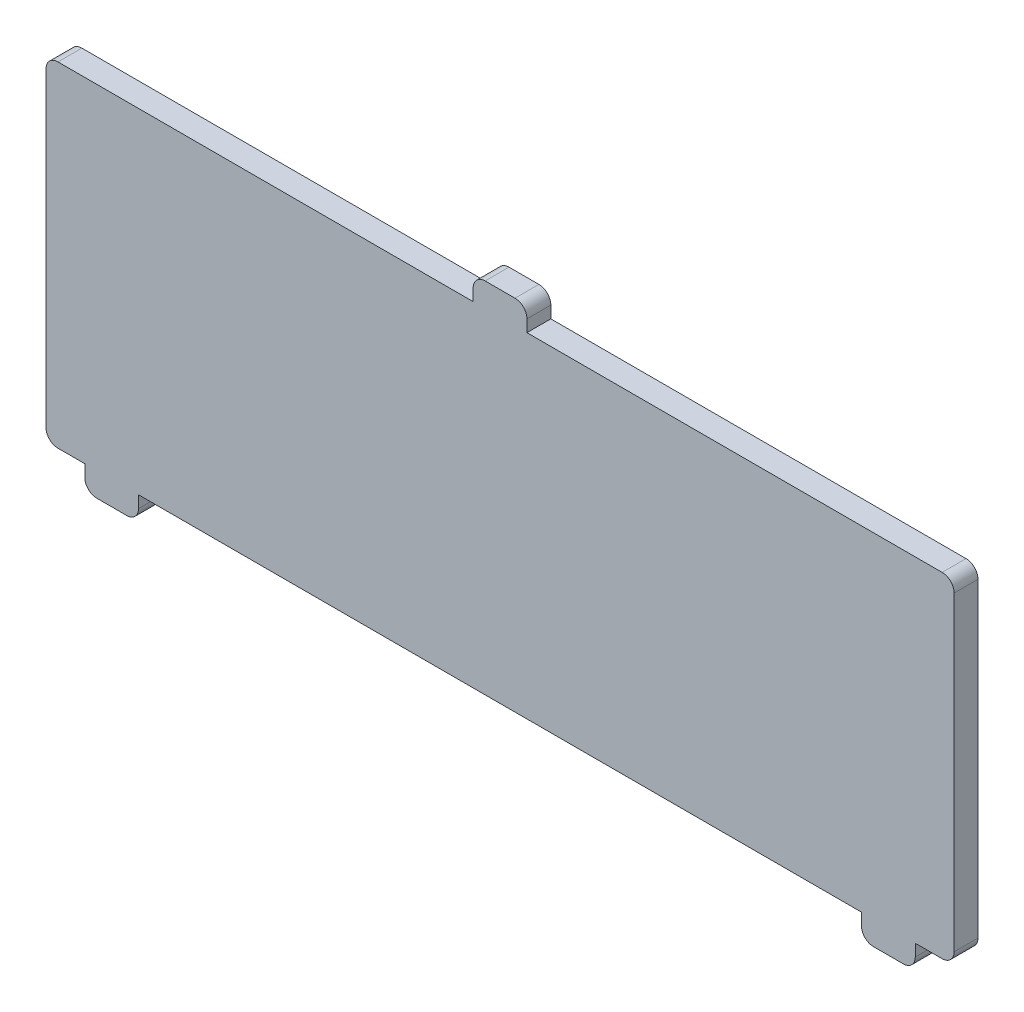
ISO-10303-21;
HEADER;
FILE_DESCRIPTION(('STEP AP214'),'2;1');
FILE_NAME('part.step','',(''),(''),'','','');
FILE_SCHEMA(('AUTOMOTIVE_DESIGN { 1 0 10303 214 1 1 1 1 }'));
ENDSEC;
DATA;
#1=APPLICATION_CONTEXT('core data for automotive mechanical design processes');
#2=APPLICATION_PROTOCOL_DEFINITION('international standard','automotive_design',2000,#1);
#3=PRODUCT_CONTEXT('',#1,'mechanical');
#4=PRODUCT('Part','Part','',(#3));
#5=PRODUCT_RELATED_PRODUCT_CATEGORY('part','',(#4));
#6=PRODUCT_DEFINITION_FORMATION('','',#4);
#7=PRODUCT_DEFINITION_CONTEXT('part definition',#1,'design');
#8=PRODUCT_DEFINITION('design','',#6,#7);
#9=PRODUCT_DEFINITION_SHAPE('','',#8);
#10=(LENGTH_UNIT() NAMED_UNIT(*) SI_UNIT(.MILLI.,.METRE.));
#11=(NAMED_UNIT(*) PLANE_ANGLE_UNIT() SI_UNIT($,.RADIAN.));
#12=(NAMED_UNIT(*) SI_UNIT($,.STERADIAN.) SOLID_ANGLE_UNIT());
#13=UNCERTAINTY_MEASURE_WITH_UNIT(LENGTH_MEASURE(1.E-05),#10,'distance_accuracy_value','');
#14=(GEOMETRIC_REPRESENTATION_CONTEXT(3) GLOBAL_UNCERTAINTY_ASSIGNED_CONTEXT((#13)) GLOBAL_UNIT_ASSIGNED_CONTEXT((#10,
#11,#12)) REPRESENTATION_CONTEXT('',''));
#15=CARTESIAN_POINT('',(0.,0.,0.));
#16=DIRECTION('',(0.,0.,1.));
#17=DIRECTION('',(1.,0.,0.));
#18=AXIS2_PLACEMENT_3D('',#15,#16,#17);
#19=CARTESIAN_POINT('',(0.,-14.,1.));
#20=DIRECTION('',(0.,1.,0.));
#21=DIRECTION('',(0.,0.,1.));
#22=AXIS2_PLACEMENT_3D('',#19,#20,#21);
#23=PLANE('',#22);
#24=DIRECTION('',(1.,0.,0.));
#25=VECTOR('',#24,1.);
#26=CARTESIAN_POINT('',(0.,-14.,-1.));
#27=LINE('',#26,#25);
#28=CARTESIAN_POINT('',(34.75,-14.,-1.));
#29=VERTEX_POINT('',#28);
#30=CARTESIAN_POINT('',(37.,-14.,-1.));
#31=VERTEX_POINT('',#30);
#32=EDGE_CURVE('E290',#29,#31,#27,.T.);
#33=ORIENTED_EDGE('',*,*,#32,.T.);
#34=DIRECTION('',(0.,0.,-1.));
#35=VECTOR('',#34,1.);
#36=CARTESIAN_POINT('',(37.,-14.,1.));
#37=LINE('',#36,#35);
#38=CARTESIAN_POINT('',(37.,-14.,1.));
#39=VERTEX_POINT('',#38);
#40=EDGE_CURVE('E57',#31,#39,#37,.F.);
#41=ORIENTED_EDGE('',*,*,#40,.T.);
#42=DIRECTION('',(1.,0.,0.));
#43=VECTOR('',#42,1.);
#44=CARTESIAN_POINT('',(0.,-14.,1.));
#45=LINE('',#44,#43);
#46=CARTESIAN_POINT('',(34.75,-14.,1.));
#47=VERTEX_POINT('',#46);
#48=EDGE_CURVE('E234',#47,#39,#45,.T.);
#49=ORIENTED_EDGE('',*,*,#48,.F.);
#50=DIRECTION('',(0.,0.,-1.));
#51=VECTOR('',#50,1.);
#52=CARTESIAN_POINT('',(34.75,-14.,1.));
#53=LINE('',#52,#51);
#54=EDGE_CURVE('E314',#47,#29,#53,.T.);
#55=ORIENTED_EDGE('',*,*,#54,.T.);
#56=EDGE_LOOP('',(#33,#41,#49,#55));
#57=FACE_BOUND('',#56,.T.);
#58=ADVANCED_FACE('F41',(#57),#23,.F.);
#59=CARTESIAN_POINT('',(34.7499999999999,2.41126563160775E-13,1.));
#60=DIRECTION('',(1.,0.,0.));
#61=DIRECTION('',(0.,1.,0.));
#62=AXIS2_PLACEMENT_3D('',#59,#60,#61);
#63=PLANE('',#62);
#64=DIRECTION('',(0.,-1.,0.));
#65=VECTOR('',#64,1.);
#66=CARTESIAN_POINT('',(34.7499999999999,2.41126563160775E-13,1.));
#67=LINE('',#66,#65);
#68=CARTESIAN_POINT('',(34.75,-15.,1.));
#69=VERTEX_POINT('',#68);
#70=EDGE_CURVE('E271',#47,#69,#67,.T.);
#71=ORIENTED_EDGE('',*,*,#70,.T.);
#72=DIRECTION('',(0.,0.,-1.));
#73=VECTOR('',#72,1.);
#74=CARTESIAN_POINT('',(34.75,-15.,1.));
#75=LINE('',#74,#73);
#76=CARTESIAN_POINT('',(34.75,-15.,-1.));
#77=VERTEX_POINT('',#76);
#78=EDGE_CURVE('E446',#69,#77,#75,.T.);
#79=ORIENTED_EDGE('',*,*,#78,.T.);
#80=DIRECTION('',(0.,-1.,0.));
#81=VECTOR('',#80,1.);
#82=CARTESIAN_POINT('',(34.7499999999999,2.41126563160775E-13,-1.));
#83=LINE('',#82,#81);
#84=EDGE_CURVE('E310',#29,#77,#83,.T.);
#85=ORIENTED_EDGE('',*,*,#84,.F.);
#86=ORIENTED_EDGE('',*,*,#54,.F.);
#87=EDGE_LOOP('',(#71,#79,#85,#86));
#88=FACE_BOUND('',#87,.T.);
#89=ADVANCED_FACE('F550',(#88),#63,.T.);
#90=CARTESIAN_POINT('',(0.,-16.,1.));
#91=DIRECTION('',(0.,-1.,0.));
#92=DIRECTION('',(0.,0.,-1.));
#93=AXIS2_PLACEMENT_3D('',#90,#91,#92);
#94=PLANE('',#93);
#95=DIRECTION('',(-1.,0.,0.));
#96=VECTOR('',#95,1.);
#97=CARTESIAN_POINT('',(0.,-16.,1.));
#98=LINE('',#97,#96);
#99=CARTESIAN_POINT('',(33.75,-16.,1.));
#100=VERTEX_POINT('',#99);
#101=CARTESIAN_POINT('',(31.25,-16.,1.));
#102=VERTEX_POINT('',#101);
#103=EDGE_CURVE('E267',#100,#102,#98,.T.);
#104=ORIENTED_EDGE('',*,*,#103,.T.);
#105=DIRECTION('',(0.,0.,-1.));
#106=VECTOR('',#105,1.);
#107=CARTESIAN_POINT('',(31.25,-16.,-1.));
#108=LINE('',#107,#106);
#109=CARTESIAN_POINT('',(31.25,-16.,-1.));
#110=VERTEX_POINT('',#109);
#111=EDGE_CURVE('E439',#102,#110,#108,.T.);
#112=ORIENTED_EDGE('',*,*,#111,.T.);
#113=DIRECTION('',(-1.,0.,0.));
#114=VECTOR('',#113,1.);
#115=CARTESIAN_POINT('',(0.,-16.,-1.));
#116=LINE('',#115,#114);
#117=CARTESIAN_POINT('',(33.75,-16.,-1.));
#118=VERTEX_POINT('',#117);
#119=EDGE_CURVE('E306',#118,#110,#116,.T.);
#120=ORIENTED_EDGE('',*,*,#119,.F.);
#121=DIRECTION('',(0.,0.,-1.));
#122=VECTOR('',#121,1.);
#123=CARTESIAN_POINT('',(33.75,-16.,1.));
#124=LINE('',#123,#122);
#125=EDGE_CURVE('E436',#118,#100,#124,.F.);
#126=ORIENTED_EDGE('',*,*,#125,.T.);
#127=EDGE_LOOP('',(#104,#112,#120,#126));
#128=FACE_BOUND('',#127,.T.);
#129=ADVANCED_FACE('F543',(#128),#94,.T.);
#130=CARTESIAN_POINT('',(30.25,0.,1.));
#131=DIRECTION('',(1.,0.,0.));
#132=DIRECTION('',(0.,1.,0.));
#133=AXIS2_PLACEMENT_3D('',#130,#131,#132);
#134=PLANE('',#133);
#135=DIRECTION('',(0.,-1.,0.));
#136=VECTOR('',#135,1.);
#137=CARTESIAN_POINT('',(30.25,0.,-1.));
#138=LINE('',#137,#136);
#139=CARTESIAN_POINT('',(30.25,-14.,-1.));
#140=VERTEX_POINT('',#139);
#141=CARTESIAN_POINT('',(30.25,-15.,-1.));
#142=VERTEX_POINT('',#141);
#143=EDGE_CURVE('E302',#140,#142,#138,.T.);
#144=ORIENTED_EDGE('',*,*,#143,.T.);
#145=DIRECTION('',(0.,0.,-1.));
#146=VECTOR('',#145,1.);
#147=CARTESIAN_POINT('',(30.25,-15.,1.));
#148=LINE('',#147,#146);
#149=CARTESIAN_POINT('',(30.25,-15.,1.));
#150=VERTEX_POINT('',#149);
#151=EDGE_CURVE('E443',#142,#150,#148,.F.);
#152=ORIENTED_EDGE('',*,*,#151,.T.);
#153=DIRECTION('',(0.,-1.,0.));
#154=VECTOR('',#153,1.);
#155=CARTESIAN_POINT('',(30.25,0.,1.));
#156=LINE('',#155,#154);
#157=CARTESIAN_POINT('',(30.25,-14.,1.));
#158=VERTEX_POINT('',#157);
#159=EDGE_CURVE('E263',#158,#150,#156,.T.);
#160=ORIENTED_EDGE('',*,*,#159,.F.);
#161=DIRECTION('',(0.,0.,-1.));
#162=VECTOR('',#161,1.);
#163=CARTESIAN_POINT('',(30.25,-14.,1.));
#164=LINE('',#163,#162);
#165=EDGE_CURVE('E317',#158,#140,#164,.T.);
#166=ORIENTED_EDGE('',*,*,#165,.T.);
#167=EDGE_LOOP('',(#144,#152,#160,#166));
#168=FACE_BOUND('',#167,.T.);
#169=ADVANCED_FACE('F535',(#168),#134,.F.);
#170=CARTESIAN_POINT('',(-30.25,-14.,-1.));
#171=VERTEX_POINT('',#170);
#172=EDGE_CURVE('E291',#171,#140,#27,.T.);
#173=ORIENTED_EDGE('',*,*,#172,.T.);
#174=ORIENTED_EDGE('',*,*,#165,.F.);
#175=CARTESIAN_POINT('',(-30.25,-14.,1.));
#176=VERTEX_POINT('',#175);
#177=EDGE_CURVE('E235',#176,#158,#45,.T.);
#178=ORIENTED_EDGE('',*,*,#177,.F.);
#179=DIRECTION('',(0.,0.,-1.));
#180=VECTOR('',#179,1.);
#181=CARTESIAN_POINT('',(-30.25,-14.,1.));
#182=LINE('',#181,#180);
#183=EDGE_CURVE('E246',#176,#171,#182,.T.);
#184=ORIENTED_EDGE('',*,*,#183,.T.);
#185=EDGE_LOOP('',(#173,#174,#178,#184));
#186=FACE_BOUND('',#185,.T.);
#187=ADVANCED_FACE('F529',(#186),#23,.F.);
#188=CARTESIAN_POINT('',(-30.25,0.,1.));
#189=DIRECTION('',(1.,0.,0.));
#190=DIRECTION('',(0.,1.,0.));
#191=AXIS2_PLACEMENT_3D('',#188,#189,#190);
#192=PLANE('',#191);
#193=DIRECTION('',(0.,-1.,0.));
#194=VECTOR('',#193,1.);
#195=CARTESIAN_POINT('',(-30.25,0.,1.));
#196=LINE('',#195,#194);
#197=CARTESIAN_POINT('',(-30.25,-15.,1.));
#198=VERTEX_POINT('',#197);
#199=EDGE_CURVE('E256',#176,#198,#196,.T.);
#200=ORIENTED_EDGE('',*,*,#199,.T.);
#201=DIRECTION('',(0.,0.,-1.));
#202=VECTOR('',#201,1.);
#203=CARTESIAN_POINT('',(-30.25,-15.,-1.));
#204=LINE('',#203,#202);
#205=CARTESIAN_POINT('',(-30.25,-15.,-1.));
#206=VERTEX_POINT('',#205);
#207=EDGE_CURVE('E420',#198,#206,#204,.T.);
#208=ORIENTED_EDGE('',*,*,#207,.T.);
#209=DIRECTION('',(0.,-1.,0.));
#210=VECTOR('',#209,1.);
#211=CARTESIAN_POINT('',(-30.25,0.,-1.));
#212=LINE('',#211,#210);
#213=EDGE_CURVE('E298',#171,#206,#212,.T.);
#214=ORIENTED_EDGE('',*,*,#213,.F.);
#215=ORIENTED_EDGE('',*,*,#183,.F.);
#216=EDGE_LOOP('',(#200,#208,#214,#215));
#217=FACE_BOUND('',#216,.T.);
#218=ADVANCED_FACE('F587',(#217),#192,.T.);
#219=CARTESIAN_POINT('',(0.,-16.,1.));
#220=DIRECTION('',(0.,1.,0.));
#221=DIRECTION('',(0.,0.,1.));
#222=AXIS2_PLACEMENT_3D('',#219,#220,#221);
#223=PLANE('',#222);
#224=DIRECTION('',(1.,0.,0.));
#225=VECTOR('',#224,1.);
#226=CARTESIAN_POINT('',(0.,-16.,-1.));
#227=LINE('',#226,#225);
#228=CARTESIAN_POINT('',(-33.75,-16.,-1.));
#229=VERTEX_POINT('',#228);
#230=CARTESIAN_POINT('',(-31.25,-16.,-1.));
#231=VERTEX_POINT('',#230);
#232=EDGE_CURVE('E294',#229,#231,#227,.T.);
#233=ORIENTED_EDGE('',*,*,#232,.T.);
#234=DIRECTION('',(0.,0.,-1.));
#235=VECTOR('',#234,1.);
#236=CARTESIAN_POINT('',(-31.25,-16.,1.));
#237=LINE('',#236,#235);
#238=CARTESIAN_POINT('',(-31.25,-16.,1.));
#239=VERTEX_POINT('',#238);
#240=EDGE_CURVE('E428',#231,#239,#237,.F.);
#241=ORIENTED_EDGE('',*,*,#240,.T.);
#242=DIRECTION('',(1.,0.,0.));
#243=VECTOR('',#242,1.);
#244=CARTESIAN_POINT('',(0.,-16.,1.));
#245=LINE('',#244,#243);
#246=CARTESIAN_POINT('',(-33.75,-16.,1.));
#247=VERTEX_POINT('',#246);
#248=EDGE_CURVE('E252',#247,#239,#245,.T.);
#249=ORIENTED_EDGE('',*,*,#248,.F.);
#250=DIRECTION('',(0.,0.,-1.));
#251=VECTOR('',#250,1.);
#252=CARTESIAN_POINT('',(-33.75,-16.,1.));
#253=LINE('',#252,#251);
#254=EDGE_CURVE('E424',#247,#229,#253,.T.);
#255=ORIENTED_EDGE('',*,*,#254,.T.);
#256=EDGE_LOOP('',(#233,#241,#249,#255));
#257=FACE_BOUND('',#256,.T.);
#258=ADVANCED_FACE('F592',(#257),#223,.F.);
#259=CARTESIAN_POINT('',(-34.75,0.,1.));
#260=DIRECTION('',(1.,0.,0.));
#261=DIRECTION('',(0.,0.,-1.));
#262=AXIS2_PLACEMENT_3D('',#259,#260,#261);
#263=PLANE('',#262);
#264=DIRECTION('',(0.,-1.,0.));
#265=VECTOR('',#264,1.);
#266=CARTESIAN_POINT('',(-34.75,0.,-1.));
#267=LINE('',#266,#265);
#268=CARTESIAN_POINT('',(-34.75,-14.,-1.));
#269=VERTEX_POINT('',#268);
#270=CARTESIAN_POINT('',(-34.75,-15.,-1.));
#271=VERTEX_POINT('',#270);
#272=EDGE_CURVE('E289',#269,#271,#267,.T.);
#273=ORIENTED_EDGE('',*,*,#272,.T.);
#274=DIRECTION('',(0.,0.,-1.));
#275=VECTOR('',#274,1.);
#276=CARTESIAN_POINT('',(-34.75,-15.,1.));
#277=LINE('',#276,#275);
#278=CARTESIAN_POINT('',(-34.75,-15.,1.));
#279=VERTEX_POINT('',#278);
#280=EDGE_CURVE('E250',#271,#279,#277,.F.);
#281=ORIENTED_EDGE('',*,*,#280,.T.);
#282=DIRECTION('',(0.,-1.,0.));
#283=VECTOR('',#282,1.);
#284=CARTESIAN_POINT('',(-34.75,0.,1.));
#285=LINE('',#284,#283);
#286=CARTESIAN_POINT('',(-34.75,-14.,1.));
#287=VERTEX_POINT('',#286);
#288=EDGE_CURVE('E223',#287,#279,#285,.T.);
#289=ORIENTED_EDGE('',*,*,#288,.F.);
#290=DIRECTION('',(0.,0.,-1.));
#291=VECTOR('',#290,1.);
#292=CARTESIAN_POINT('',(-34.75,-14.,1.));
#293=LINE('',#292,#291);
#294=EDGE_CURVE('E237',#287,#269,#293,.T.);
#295=ORIENTED_EDGE('',*,*,#294,.T.);
#296=EDGE_LOOP('',(#273,#281,#289,#295));
#297=FACE_BOUND('',#296,.T.);
#298=ADVANCED_FACE('F248',(#297),#263,.F.);
#299=CARTESIAN_POINT('',(-37.,-14.,1.));
#300=VERTEX_POINT('',#299);
#301=EDGE_CURVE('E218',#300,#287,#45,.T.);
#302=ORIENTED_EDGE('',*,*,#301,.F.);
#303=DIRECTION('',(0.,0.,-1.));
#304=VECTOR('',#303,1.);
#305=CARTESIAN_POINT('',(-37.,-14.,1.));
#306=LINE('',#305,#304);
#307=CARTESIAN_POINT('',(-37.,-14.,-1.));
#308=VERTEX_POINT('',#307);
#309=EDGE_CURVE('E433',#300,#308,#306,.T.);
#310=ORIENTED_EDGE('',*,*,#309,.T.);
#311=EDGE_CURVE('E240',#308,#269,#27,.T.);
#312=ORIENTED_EDGE('',*,*,#311,.T.);
#313=ORIENTED_EDGE('',*,*,#294,.F.);
#314=EDGE_LOOP('',(#302,#310,#312,#313));
#315=FACE_BOUND('',#314,.T.);
#316=ADVANCED_FACE('F238',(#315),#23,.F.);
#317=CARTESIAN_POINT('',(38.,0.,1.));
#318=DIRECTION('',(1.,0.,0.));
#319=DIRECTION('',(0.,1.,0.));
#320=AXIS2_PLACEMENT_3D('',#317,#318,#319);
#321=PLANE('',#320);
#322=DIRECTION('',(0.,-1.,0.));
#323=VECTOR('',#322,1.);
#324=CARTESIAN_POINT('',(38.,0.,1.));
#325=LINE('',#324,#323);
#326=CARTESIAN_POINT('',(38.,13.,1.));
#327=VERTEX_POINT('',#326);
#328=CARTESIAN_POINT('',(38.,-13.,1.));
#329=VERTEX_POINT('',#328);
#330=EDGE_CURVE('E516',#327,#329,#325,.T.);
#331=ORIENTED_EDGE('',*,*,#330,.T.);
#332=DIRECTION('',(0.,0.,-1.));
#333=VECTOR('',#332,1.);
#334=CARTESIAN_POINT('',(38.,-13.,-1.));
#335=LINE('',#334,#333);
#336=CARTESIAN_POINT('',(38.,-13.,-1.));
#337=VERTEX_POINT('',#336);
#338=EDGE_CURVE('E453',#329,#337,#335,.T.);
#339=ORIENTED_EDGE('',*,*,#338,.T.);
#340=DIRECTION('',(0.,-1.,0.));
#341=VECTOR('',#340,1.);
#342=CARTESIAN_POINT('',(38.,0.,-1.));
#343=LINE('',#342,#341);
#344=CARTESIAN_POINT('',(38.,13.,-1.));
#345=VERTEX_POINT('',#344);
#346=EDGE_CURVE('E274',#345,#337,#343,.T.);
#347=ORIENTED_EDGE('',*,*,#346,.F.);
#348=DIRECTION('',(0.,0.,-1.));
#349=VECTOR('',#348,1.);
#350=CARTESIAN_POINT('',(38.,13.,1.));
#351=LINE('',#350,#349);
#352=EDGE_CURVE('E450',#345,#327,#351,.F.);
#353=ORIENTED_EDGE('',*,*,#352,.T.);
#354=EDGE_LOOP('',(#331,#339,#347,#353));
#355=FACE_BOUND('',#354,.T.);
#356=ADVANCED_FACE('F555',(#355),#321,.T.);
#357=CARTESIAN_POINT('',(-38.,0.,1.));
#358=DIRECTION('',(1.,0.,0.));
#359=DIRECTION('',(0.,1.,0.));
#360=AXIS2_PLACEMENT_3D('',#357,#358,#359);
#361=PLANE('',#360);
#362=DIRECTION('',(0.,-1.,0.));
#363=VECTOR('',#362,1.);
#364=CARTESIAN_POINT('',(-38.,0.,1.));
#365=LINE('',#364,#363);
#366=CARTESIAN_POINT('',(-38.,13.,1.));
#367=VERTEX_POINT('',#366);
#368=CARTESIAN_POINT('',(-38.,-13.,1.));
#369=VERTEX_POINT('',#368);
#370=EDGE_CURVE('E232',#367,#369,#365,.T.);
#371=ORIENTED_EDGE('',*,*,#370,.F.);
#372=DIRECTION('',(0.,0.,-1.));
#373=VECTOR('',#372,1.);
#374=CARTESIAN_POINT('',(-38.,13.,-1.));
#375=LINE('',#374,#373);
#376=CARTESIAN_POINT('',(-38.,13.,-1.));
#377=VERTEX_POINT('',#376);
#378=EDGE_CURVE('E355',#367,#377,#375,.T.);
#379=ORIENTED_EDGE('',*,*,#378,.T.);
#380=DIRECTION('',(0.,-1.,0.));
#381=VECTOR('',#380,1.);
#382=CARTESIAN_POINT('',(-38.,0.,-1.));
#383=LINE('',#382,#381);
#384=CARTESIAN_POINT('',(-38.,-13.,-1.));
#385=VERTEX_POINT('',#384);
#386=EDGE_CURVE('E283',#377,#385,#383,.T.);
#387=ORIENTED_EDGE('',*,*,#386,.T.);
#388=DIRECTION('',(0.,0.,-1.));
#389=VECTOR('',#388,1.);
#390=CARTESIAN_POINT('',(-38.,-13.,1.));
#391=LINE('',#390,#389);
#392=EDGE_CURVE('E352',#385,#369,#391,.F.);
#393=ORIENTED_EDGE('',*,*,#392,.T.);
#394=EDGE_LOOP('',(#371,#379,#387,#393));
#395=FACE_BOUND('',#394,.T.);
#396=ADVANCED_FACE('F509',(#395),#361,.F.);
#397=CARTESIAN_POINT('',(0.,0.,-1.));
#398=DIRECTION('',(0.,0.,1.));
#399=DIRECTION('',(1.,0.,0.));
#400=AXIS2_PLACEMENT_3D('',#397,#398,#399);
#401=PLANE('',#400);
#402=ORIENTED_EDGE('',*,*,#386,.F.);
#403=CARTESIAN_POINT('',(-37.,13.,-1.));
#404=DIRECTION('',(0.,0.,1.));
#405=DIRECTION('',(1.,0.,0.));
#406=AXIS2_PLACEMENT_3D('',#403,#404,#405);
#407=CIRCLE('',#406,1.);
#408=CARTESIAN_POINT('',(-37.,14.,-1.));
#409=VERTEX_POINT('',#408);
#410=EDGE_CURVE('E386',#377,#409,#407,.F.);
#411=ORIENTED_EDGE('',*,*,#410,.T.);
#412=DIRECTION('',(1.,0.,0.));
#413=VECTOR('',#412,1.);
#414=CARTESIAN_POINT('',(0.,14.,-1.));
#415=LINE('',#414,#413);
#416=CARTESIAN_POINT('',(-2.25,14.,-1.));
#417=VERTEX_POINT('',#416);
#418=EDGE_CURVE('E280',#409,#417,#415,.T.);
#419=ORIENTED_EDGE('',*,*,#418,.T.);
#420=DIRECTION('',(0.,1.,0.));
#421=VECTOR('',#420,1.);
#422=CARTESIAN_POINT('',(-2.25,14.,-1.));
#423=LINE('',#422,#421);
#424=CARTESIAN_POINT('',(-2.25,15.,-1.));
#425=VERTEX_POINT('',#424);
#426=EDGE_CURVE('E328',#417,#425,#423,.T.);
#427=ORIENTED_EDGE('',*,*,#426,.T.);
#428=CARTESIAN_POINT('',(-1.25,15.,-1.));
#429=DIRECTION('',(0.,0.,1.));
#430=DIRECTION('',(1.,0.,0.));
#431=AXIS2_PLACEMENT_3D('',#428,#429,#430);
#432=CIRCLE('',#431,1.);
#433=CARTESIAN_POINT('',(-1.25,16.,-1.));
#434=VERTEX_POINT('',#433);
#435=EDGE_CURVE('E359',#425,#434,#432,.F.);
#436=ORIENTED_EDGE('',*,*,#435,.T.);
#437=DIRECTION('',(1.,0.,0.));
#438=VECTOR('',#437,1.);
#439=CARTESIAN_POINT('',(-2.25,16.,-1.));
#440=LINE('',#439,#438);
#441=CARTESIAN_POINT('',(1.25,16.,-1.));
#442=VERTEX_POINT('',#441);
#443=EDGE_CURVE('E339',#434,#442,#440,.T.);
#444=ORIENTED_EDGE('',*,*,#443,.T.);
#445=CARTESIAN_POINT('',(1.25,15.,-1.));
#446=DIRECTION('',(0.,0.,1.));
#447=DIRECTION('',(1.,0.,0.));
#448=AXIS2_PLACEMENT_3D('',#445,#446,#447);
#449=CIRCLE('',#448,1.);
#450=CARTESIAN_POINT('',(2.25,15.,-1.));
#451=VERTEX_POINT('',#450);
#452=EDGE_CURVE('E362',#442,#451,#449,.F.);
#453=ORIENTED_EDGE('',*,*,#452,.T.);
#454=DIRECTION('',(0.,1.,0.));
#455=VECTOR('',#454,1.);
#456=CARTESIAN_POINT('',(2.25,14.,-1.));
#457=LINE('',#456,#455);
#458=CARTESIAN_POINT('',(2.25,14.,-1.));
#459=VERTEX_POINT('',#458);
#460=EDGE_CURVE('E335',#459,#451,#457,.T.);
#461=ORIENTED_EDGE('',*,*,#460,.F.);
#462=CARTESIAN_POINT('',(37.,14.,-1.));
#463=VERTEX_POINT('',#462);
#464=EDGE_CURVE('E278',#459,#463,#415,.T.);
#465=ORIENTED_EDGE('',*,*,#464,.T.);
#466=CARTESIAN_POINT('',(37.,13.,-1.));
#467=DIRECTION('',(0.,0.,1.));
#468=DIRECTION('',(1.,0.,0.));
#469=AXIS2_PLACEMENT_3D('',#466,#467,#468);
#470=CIRCLE('',#469,1.);
#471=EDGE_CURVE('E365',#463,#345,#470,.F.);
#472=ORIENTED_EDGE('',*,*,#471,.T.);
#473=ORIENTED_EDGE('',*,*,#346,.T.);
#474=CARTESIAN_POINT('',(37.,-13.,-1.));
#475=DIRECTION('',(0.,0.,1.));
#476=DIRECTION('',(1.,0.,0.));
#477=AXIS2_PLACEMENT_3D('',#474,#475,#476);
#478=CIRCLE('',#477,1.);
#479=EDGE_CURVE('E368',#337,#31,#478,.F.);
#480=ORIENTED_EDGE('',*,*,#479,.T.);
#481=ORIENTED_EDGE('',*,*,#32,.F.);
#482=ORIENTED_EDGE('',*,*,#84,.T.);
#483=CARTESIAN_POINT('',(33.75,-15.,-1.));
#484=DIRECTION('',(0.,0.,1.));
#485=DIRECTION('',(1.,0.,0.));
#486=AXIS2_PLACEMENT_3D('',#483,#484,#485);
#487=CIRCLE('',#486,1.);
#488=EDGE_CURVE('E371',#77,#118,#487,.F.);
#489=ORIENTED_EDGE('',*,*,#488,.T.);
#490=ORIENTED_EDGE('',*,*,#119,.T.);
#491=CARTESIAN_POINT('',(31.25,-15.,-1.));
#492=DIRECTION('',(0.,0.,1.));
#493=DIRECTION('',(1.,0.,0.));
#494=AXIS2_PLACEMENT_3D('',#491,#492,#493);
#495=CIRCLE('',#494,1.);
#496=EDGE_CURVE('E374',#110,#142,#495,.F.);
#497=ORIENTED_EDGE('',*,*,#496,.T.);
#498=ORIENTED_EDGE('',*,*,#143,.F.);
#499=ORIENTED_EDGE('',*,*,#172,.F.);
#500=ORIENTED_EDGE('',*,*,#213,.T.);
#501=CARTESIAN_POINT('',(-31.25,-15.,-1.));
#502=DIRECTION('',(0.,0.,1.));
#503=DIRECTION('',(1.,0.,0.));
#504=AXIS2_PLACEMENT_3D('',#501,#502,#503);
#505=CIRCLE('',#504,1.);
#506=EDGE_CURVE('E383',#206,#231,#505,.F.);
#507=ORIENTED_EDGE('',*,*,#506,.T.);
#508=ORIENTED_EDGE('',*,*,#232,.F.);
#509=CARTESIAN_POINT('',(-33.75,-15.,-1.));
#510=DIRECTION('',(0.,0.,1.));
#511=DIRECTION('',(1.,0.,0.));
#512=AXIS2_PLACEMENT_3D('',#509,#510,#511);
#513=CIRCLE('',#512,1.);
#514=EDGE_CURVE('E380',#229,#271,#513,.F.);
#515=ORIENTED_EDGE('',*,*,#514,.T.);
#516=ORIENTED_EDGE('',*,*,#272,.F.);
#517=ORIENTED_EDGE('',*,*,#311,.F.);
#518=CARTESIAN_POINT('',(-37.,-13.,-1.));
#519=DIRECTION('',(0.,0.,1.));
#520=DIRECTION('',(1.,0.,0.));
#521=AXIS2_PLACEMENT_3D('',#518,#519,#520);
#522=CIRCLE('',#521,1.);
#523=EDGE_CURVE('E377',#308,#385,#522,.F.);
#524=ORIENTED_EDGE('',*,*,#523,.T.);
#525=EDGE_LOOP('',(#402,#411,#419,#427,#436,#444,#453,#461,#465,#472,#473,#480,#481,#482,#489,
#490,#497,#498,#499,#500,#507,#508,#515,#516,#517,#524));
#526=FACE_BOUND('',#525,.T.);
#527=ADVANCED_FACE('F489',(#526),#401,.F.);
#528=CARTESIAN_POINT('',(0.,0.,1.));
#529=DIRECTION('',(0.,0.,1.));
#530=DIRECTION('',(1.,0.,0.));
#531=AXIS2_PLACEMENT_3D('',#528,#529,#530);
#532=PLANE('',#531);
#533=DIRECTION('',(1.,0.,0.));
#534=VECTOR('',#533,1.);
#535=CARTESIAN_POINT('',(0.,14.,1.));
#536=LINE('',#535,#534);
#537=CARTESIAN_POINT('',(-37.,14.,1.));
#538=VERTEX_POINT('',#537);
#539=CARTESIAN_POINT('',(-2.25,14.,1.));
#540=VERTEX_POINT('',#539);
#541=EDGE_CURVE('E498',#538,#540,#536,.T.);
#542=ORIENTED_EDGE('',*,*,#541,.F.);
#543=CARTESIAN_POINT('',(-37.,13.,1.));
#544=DIRECTION('',(0.,0.,1.));
#545=DIRECTION('',(1.,0.,0.));
#546=AXIS2_PLACEMENT_3D('',#543,#544,#545);
#547=CIRCLE('',#546,1.);
#548=EDGE_CURVE('E417',#538,#367,#547,.T.);
#549=ORIENTED_EDGE('',*,*,#548,.T.);
#550=ORIENTED_EDGE('',*,*,#370,.T.);
#551=CARTESIAN_POINT('',(-37.,-13.,1.));
#552=DIRECTION('',(0.,0.,1.));
#553=DIRECTION('',(1.,0.,0.));
#554=AXIS2_PLACEMENT_3D('',#551,#552,#553);
#555=CIRCLE('',#554,1.);
#556=EDGE_CURVE('E227',#369,#300,#555,.T.);
#557=ORIENTED_EDGE('',*,*,#556,.T.);
#558=ORIENTED_EDGE('',*,*,#301,.T.);
#559=ORIENTED_EDGE('',*,*,#288,.T.);
#560=CARTESIAN_POINT('',(-33.75,-15.,1.));
#561=DIRECTION('',(0.,0.,1.));
#562=DIRECTION('',(1.,0.,0.));
#563=AXIS2_PLACEMENT_3D('',#560,#561,#562);
#564=CIRCLE('',#563,1.);
#565=EDGE_CURVE('E411',#279,#247,#564,.T.);
#566=ORIENTED_EDGE('',*,*,#565,.T.);
#567=ORIENTED_EDGE('',*,*,#248,.T.);
#568=CARTESIAN_POINT('',(-31.25,-15.,1.));
#569=DIRECTION('',(0.,0.,1.));
#570=DIRECTION('',(1.,0.,0.));
#571=AXIS2_PLACEMENT_3D('',#568,#569,#570);
#572=CIRCLE('',#571,1.);
#573=EDGE_CURVE('E414',#239,#198,#572,.T.);
#574=ORIENTED_EDGE('',*,*,#573,.T.);
#575=ORIENTED_EDGE('',*,*,#199,.F.);
#576=ORIENTED_EDGE('',*,*,#177,.T.);
#577=ORIENTED_EDGE('',*,*,#159,.T.);
#578=CARTESIAN_POINT('',(31.25,-15.,1.));
#579=DIRECTION('',(0.,0.,1.));
#580=DIRECTION('',(1.,0.,0.));
#581=AXIS2_PLACEMENT_3D('',#578,#579,#580);
#582=CIRCLE('',#581,1.);
#583=EDGE_CURVE('E406',#150,#102,#582,.T.);
#584=ORIENTED_EDGE('',*,*,#583,.T.);
#585=ORIENTED_EDGE('',*,*,#103,.F.);
#586=CARTESIAN_POINT('',(33.75,-15.,1.));
#587=DIRECTION('',(0.,0.,1.));
#588=DIRECTION('',(1.,0.,0.));
#589=AXIS2_PLACEMENT_3D('',#586,#587,#588);
#590=CIRCLE('',#589,1.);
#591=EDGE_CURVE('E65',#100,#69,#590,.T.);
#592=ORIENTED_EDGE('',*,*,#591,.T.);
#593=ORIENTED_EDGE('',*,*,#70,.F.);
#594=ORIENTED_EDGE('',*,*,#48,.T.);
#595=CARTESIAN_POINT('',(37.,-13.,1.));
#596=DIRECTION('',(0.,0.,1.));
#597=DIRECTION('',(1.,0.,0.));
#598=AXIS2_PLACEMENT_3D('',#595,#596,#597);
#599=CIRCLE('',#598,1.);
#600=EDGE_CURVE('E401',#39,#329,#599,.T.);
#601=ORIENTED_EDGE('',*,*,#600,.T.);
#602=ORIENTED_EDGE('',*,*,#330,.F.);
#603=CARTESIAN_POINT('',(37.,13.,1.));
#604=DIRECTION('',(0.,0.,1.));
#605=DIRECTION('',(1.,0.,0.));
#606=AXIS2_PLACEMENT_3D('',#603,#604,#605);
#607=CIRCLE('',#606,1.);
#608=CARTESIAN_POINT('',(37.,14.,1.));
#609=VERTEX_POINT('',#608);
#610=EDGE_CURVE('E398',#327,#609,#607,.T.);
#611=ORIENTED_EDGE('',*,*,#610,.T.);
#612=CARTESIAN_POINT('',(2.25,14.,1.));
#613=VERTEX_POINT('',#612);
#614=EDGE_CURVE('E480',#613,#609,#536,.T.);
#615=ORIENTED_EDGE('',*,*,#614,.F.);
#616=DIRECTION('',(0.,1.,0.));
#617=VECTOR('',#616,1.);
#618=CARTESIAN_POINT('',(2.25,14.,1.));
#619=LINE('',#618,#617);
#620=CARTESIAN_POINT('',(2.25,15.,1.));
#621=VERTEX_POINT('',#620);
#622=EDGE_CURVE('E323',#613,#621,#619,.T.);
#623=ORIENTED_EDGE('',*,*,#622,.T.);
#624=CARTESIAN_POINT('',(1.25,15.,1.));
#625=DIRECTION('',(0.,0.,1.));
#626=DIRECTION('',(1.,0.,0.));
#627=AXIS2_PLACEMENT_3D('',#624,#625,#626);
#628=CIRCLE('',#627,1.);
#629=CARTESIAN_POINT('',(1.25,16.,1.));
#630=VERTEX_POINT('',#629);
#631=EDGE_CURVE('E395',#621,#630,#628,.T.);
#632=ORIENTED_EDGE('',*,*,#631,.T.);
#633=DIRECTION('',(1.,0.,0.));
#634=VECTOR('',#633,1.);
#635=CARTESIAN_POINT('',(-2.25,16.,1.));
#636=LINE('',#635,#634);
#637=CARTESIAN_POINT('',(-1.25,16.,1.));
#638=VERTEX_POINT('',#637);
#639=EDGE_CURVE('E327',#638,#630,#636,.T.);
#640=ORIENTED_EDGE('',*,*,#639,.F.);
#641=CARTESIAN_POINT('',(-1.25,15.,1.));
#642=DIRECTION('',(0.,0.,1.));
#643=DIRECTION('',(1.,0.,0.));
#644=AXIS2_PLACEMENT_3D('',#641,#642,#643);
#645=CIRCLE('',#644,1.);
#646=CARTESIAN_POINT('',(-2.25,15.,1.));
#647=VERTEX_POINT('',#646);
#648=EDGE_CURVE('E392',#638,#647,#645,.T.);
#649=ORIENTED_EDGE('',*,*,#648,.T.);
#650=DIRECTION('',(0.,1.,0.));
#651=VECTOR('',#650,1.);
#652=CARTESIAN_POINT('',(-2.25,14.,1.));
#653=LINE('',#652,#651);
#654=EDGE_CURVE('E279',#540,#647,#653,.T.);
#655=ORIENTED_EDGE('',*,*,#654,.F.);
#656=EDGE_LOOP('',(#542,#549,#550,#557,#558,#559,#566,#567,#574,#575,#576,#577,#584,#585,#592,
#593,#594,#601,#602,#611,#615,#623,#632,#640,#649,#655));
#657=FACE_BOUND('',#656,.T.);
#658=ADVANCED_FACE('F221',(#657),#532,.T.);
#659=CARTESIAN_POINT('',(0.,14.,1.));
#660=DIRECTION('',(0.,1.,0.));
#661=DIRECTION('',(0.,0.,1.));
#662=AXIS2_PLACEMENT_3D('',#659,#660,#661);
#663=PLANE('',#662);
#664=ORIENTED_EDGE('',*,*,#418,.F.);
#665=DIRECTION('',(0.,0.,-1.));
#666=VECTOR('',#665,1.);
#667=CARTESIAN_POINT('',(-37.,14.,1.));
#668=LINE('',#667,#666);
#669=EDGE_CURVE('E389',#409,#538,#668,.F.);
#670=ORIENTED_EDGE('',*,*,#669,.T.);
#671=ORIENTED_EDGE('',*,*,#541,.T.);
#672=DIRECTION('',(0.,0.,-1.));
#673=VECTOR('',#672,1.);
#674=CARTESIAN_POINT('',(-2.25,14.,1.));
#675=LINE('',#674,#673);
#676=EDGE_CURVE('E245',#540,#417,#675,.T.);
#677=ORIENTED_EDGE('',*,*,#676,.T.);
#678=EDGE_LOOP('',(#664,#670,#671,#677));
#679=FACE_BOUND('',#678,.T.);
#680=ADVANCED_FACE('F567',(#679),#663,.T.);
#681=ORIENTED_EDGE('',*,*,#614,.T.);
#682=DIRECTION('',(0.,0.,-1.));
#683=VECTOR('',#682,1.);
#684=CARTESIAN_POINT('',(37.,14.,1.));
#685=LINE('',#684,#683);
#686=EDGE_CURVE('E459',#609,#463,#685,.T.);
#687=ORIENTED_EDGE('',*,*,#686,.T.);
#688=ORIENTED_EDGE('',*,*,#464,.F.);
#689=DIRECTION('',(0.,0.,-1.));
#690=VECTOR('',#689,1.);
#691=CARTESIAN_POINT('',(2.25,14.,1.));
#692=LINE('',#691,#690);
#693=EDGE_CURVE('E349',#613,#459,#692,.T.);
#694=ORIENTED_EDGE('',*,*,#693,.F.);
#695=EDGE_LOOP('',(#681,#687,#688,#694));
#696=FACE_BOUND('',#695,.T.);
#697=ADVANCED_FACE('F562',(#696),#663,.T.);
#698=CARTESIAN_POINT('',(-2.25,16.,1.));
#699=DIRECTION('',(0.,1.,0.));
#700=DIRECTION('',(0.,0.,1.));
#701=AXIS2_PLACEMENT_3D('',#698,#699,#700);
#702=PLANE('',#701);
#703=ORIENTED_EDGE('',*,*,#639,.T.);
#704=DIRECTION('',(0.,0.,-1.));
#705=VECTOR('',#704,1.);
#706=CARTESIAN_POINT('',(1.25,16.,-1.));
#707=LINE('',#706,#705);
#708=EDGE_CURVE('E466',#630,#442,#707,.T.);
#709=ORIENTED_EDGE('',*,*,#708,.T.);
#710=ORIENTED_EDGE('',*,*,#443,.F.);
#711=DIRECTION('',(0.,0.,-1.));
#712=VECTOR('',#711,1.);
#713=CARTESIAN_POINT('',(-1.25,16.,1.));
#714=LINE('',#713,#712);
#715=EDGE_CURVE('E463',#434,#638,#714,.F.);
#716=ORIENTED_EDGE('',*,*,#715,.T.);
#717=EDGE_LOOP('',(#703,#709,#710,#716));
#718=FACE_BOUND('',#717,.T.);
#719=ADVANCED_FACE('F485',(#718),#702,.T.);
#720=CARTESIAN_POINT('',(-2.25,14.,1.));
#721=DIRECTION('',(-1.,0.,0.));
#722=DIRECTION('',(0.,0.,1.));
#723=AXIS2_PLACEMENT_3D('',#720,#721,#722);
#724=PLANE('',#723);
#725=ORIENTED_EDGE('',*,*,#654,.T.);
#726=DIRECTION('',(0.,0.,-1.));
#727=VECTOR('',#726,1.);
#728=CARTESIAN_POINT('',(-2.25,15.,1.));
#729=LINE('',#728,#727);
#730=EDGE_CURVE('E11',#647,#425,#729,.T.);
#731=ORIENTED_EDGE('',*,*,#730,.T.);
#732=ORIENTED_EDGE('',*,*,#426,.F.);
#733=ORIENTED_EDGE('',*,*,#676,.F.);
#734=EDGE_LOOP('',(#725,#731,#732,#733));
#735=FACE_BOUND('',#734,.T.);
#736=ADVANCED_FACE('F495',(#735),#724,.T.);
#737=CARTESIAN_POINT('',(2.25,14.,1.));
#738=DIRECTION('',(-1.,0.,0.));
#739=DIRECTION('',(0.,0.,1.));
#740=AXIS2_PLACEMENT_3D('',#737,#738,#739);
#741=PLANE('',#740);
#742=ORIENTED_EDGE('',*,*,#460,.T.);
#743=DIRECTION('',(0.,0.,-1.));
#744=VECTOR('',#743,1.);
#745=CARTESIAN_POINT('',(2.25,15.,1.));
#746=LINE('',#745,#744);
#747=EDGE_CURVE('E50',#451,#621,#746,.F.);
#748=ORIENTED_EDGE('',*,*,#747,.T.);
#749=ORIENTED_EDGE('',*,*,#622,.F.);
#750=ORIENTED_EDGE('',*,*,#693,.T.);
#751=EDGE_LOOP('',(#742,#748,#749,#750));
#752=FACE_BOUND('',#751,.T.);
#753=ADVANCED_FACE('F473',(#752),#741,.F.);
#754=CARTESIAN_POINT('',(-37.,13.,1.));
#755=DIRECTION('',(0.,0.,1.));
#756=DIRECTION('',(1.,0.,0.));
#757=AXIS2_PLACEMENT_3D('',#754,#755,#756);
#758=CYLINDRICAL_SURFACE('',#757,1.);
#759=ORIENTED_EDGE('',*,*,#548,.F.);
#760=ORIENTED_EDGE('',*,*,#669,.F.);
#761=ORIENTED_EDGE('',*,*,#410,.F.);
#762=ORIENTED_EDGE('',*,*,#378,.F.);
#763=EDGE_LOOP('',(#759,#760,#761,#762));
#764=FACE_BOUND('',#763,.T.);
#765=ADVANCED_FACE('F507',(#764),#758,.T.);
#766=CARTESIAN_POINT('',(-31.25,-15.,1.));
#767=DIRECTION('',(0.,0.,1.));
#768=DIRECTION('',(1.,0.,0.));
#769=AXIS2_PLACEMENT_3D('',#766,#767,#768);
#770=CYLINDRICAL_SURFACE('',#769,1.);
#771=ORIENTED_EDGE('',*,*,#573,.F.);
#772=ORIENTED_EDGE('',*,*,#240,.F.);
#773=ORIENTED_EDGE('',*,*,#506,.F.);
#774=ORIENTED_EDGE('',*,*,#207,.F.);
#775=EDGE_LOOP('',(#771,#772,#773,#774));
#776=FACE_BOUND('',#775,.T.);
#777=ADVANCED_FACE('F617',(#776),#770,.T.);
#778=CARTESIAN_POINT('',(-33.75,-15.,1.));
#779=DIRECTION('',(0.,0.,-1.));
#780=DIRECTION('',(-1.,0.,0.));
#781=AXIS2_PLACEMENT_3D('',#778,#779,#780);
#782=CYLINDRICAL_SURFACE('',#781,1.);
#783=ORIENTED_EDGE('',*,*,#565,.F.);
#784=ORIENTED_EDGE('',*,*,#280,.F.);
#785=ORIENTED_EDGE('',*,*,#514,.F.);
#786=ORIENTED_EDGE('',*,*,#254,.F.);
#787=EDGE_LOOP('',(#783,#784,#785,#786));
#788=FACE_BOUND('',#787,.T.);
#789=ADVANCED_FACE('F620',(#788),#782,.T.);
#790=CARTESIAN_POINT('',(-37.,-13.,1.));
#791=DIRECTION('',(0.,0.,-1.));
#792=DIRECTION('',(-1.,0.,0.));
#793=AXIS2_PLACEMENT_3D('',#790,#791,#792);
#794=CYLINDRICAL_SURFACE('',#793,1.);
#795=ORIENTED_EDGE('',*,*,#556,.F.);
#796=ORIENTED_EDGE('',*,*,#392,.F.);
#797=ORIENTED_EDGE('',*,*,#523,.F.);
#798=ORIENTED_EDGE('',*,*,#309,.F.);
#799=EDGE_LOOP('',(#795,#796,#797,#798));
#800=FACE_BOUND('',#799,.T.);
#801=ADVANCED_FACE('F513',(#800),#794,.T.);
#802=CARTESIAN_POINT('',(31.25,-15.,1.));
#803=DIRECTION('',(0.,0.,1.));
#804=DIRECTION('',(1.,0.,0.));
#805=AXIS2_PLACEMENT_3D('',#802,#803,#804);
#806=CYLINDRICAL_SURFACE('',#805,1.);
#807=ORIENTED_EDGE('',*,*,#583,.F.);
#808=ORIENTED_EDGE('',*,*,#151,.F.);
#809=ORIENTED_EDGE('',*,*,#496,.F.);
#810=ORIENTED_EDGE('',*,*,#111,.F.);
#811=EDGE_LOOP('',(#807,#808,#809,#810));
#812=FACE_BOUND('',#811,.T.);
#813=ADVANCED_FACE('F541',(#812),#806,.T.);
#814=CARTESIAN_POINT('',(33.75,-15.,1.));
#815=DIRECTION('',(0.,0.,-1.));
#816=DIRECTION('',(-1.,0.,0.));
#817=AXIS2_PLACEMENT_3D('',#814,#815,#816);
#818=CYLINDRICAL_SURFACE('',#817,1.);
#819=ORIENTED_EDGE('',*,*,#591,.F.);
#820=ORIENTED_EDGE('',*,*,#125,.F.);
#821=ORIENTED_EDGE('',*,*,#488,.F.);
#822=ORIENTED_EDGE('',*,*,#78,.F.);
#823=EDGE_LOOP('',(#819,#820,#821,#822));
#824=FACE_BOUND('',#823,.T.);
#825=ADVANCED_FACE('F547',(#824),#818,.T.);
#826=CARTESIAN_POINT('',(37.,-13.,1.));
#827=DIRECTION('',(0.,0.,1.));
#828=DIRECTION('',(1.,0.,0.));
#829=AXIS2_PLACEMENT_3D('',#826,#827,#828);
#830=CYLINDRICAL_SURFACE('',#829,1.);
#831=ORIENTED_EDGE('',*,*,#600,.F.);
#832=ORIENTED_EDGE('',*,*,#40,.F.);
#833=ORIENTED_EDGE('',*,*,#479,.F.);
#834=ORIENTED_EDGE('',*,*,#338,.F.);
#835=EDGE_LOOP('',(#831,#832,#833,#834));
#836=FACE_BOUND('',#835,.T.);
#837=ADVANCED_FACE('F554',(#836),#830,.T.);
#838=CARTESIAN_POINT('',(37.,13.,1.));
#839=DIRECTION('',(0.,0.,-1.));
#840=DIRECTION('',(-1.,0.,0.));
#841=AXIS2_PLACEMENT_3D('',#838,#839,#840);
#842=CYLINDRICAL_SURFACE('',#841,1.);
#843=ORIENTED_EDGE('',*,*,#610,.F.);
#844=ORIENTED_EDGE('',*,*,#352,.F.);
#845=ORIENTED_EDGE('',*,*,#471,.F.);
#846=ORIENTED_EDGE('',*,*,#686,.F.);
#847=EDGE_LOOP('',(#843,#844,#845,#846));
#848=FACE_BOUND('',#847,.T.);
#849=ADVANCED_FACE('F559',(#848),#842,.T.);
#850=CARTESIAN_POINT('',(1.25,15.,1.));
#851=DIRECTION('',(0.,0.,1.));
#852=DIRECTION('',(1.,0.,0.));
#853=AXIS2_PLACEMENT_3D('',#850,#851,#852);
#854=CYLINDRICAL_SURFACE('',#853,1.);
#855=ORIENTED_EDGE('',*,*,#631,.F.);
#856=ORIENTED_EDGE('',*,*,#747,.F.);
#857=ORIENTED_EDGE('',*,*,#452,.F.);
#858=ORIENTED_EDGE('',*,*,#708,.F.);
#859=EDGE_LOOP('',(#855,#856,#857,#858));
#860=FACE_BOUND('',#859,.T.);
#861=ADVANCED_FACE('F482',(#860),#854,.T.);
#862=CARTESIAN_POINT('',(-1.25,15.,1.));
#863=DIRECTION('',(0.,0.,-1.));
#864=DIRECTION('',(-1.,0.,0.));
#865=AXIS2_PLACEMENT_3D('',#862,#863,#864);
#866=CYLINDRICAL_SURFACE('',#865,1.);
#867=ORIENTED_EDGE('',*,*,#648,.F.);
#868=ORIENTED_EDGE('',*,*,#715,.F.);
#869=ORIENTED_EDGE('',*,*,#435,.F.);
#870=ORIENTED_EDGE('',*,*,#730,.F.);
#871=EDGE_LOOP('',(#867,#868,#869,#870));
#872=FACE_BOUND('',#871,.T.);
#873=ADVANCED_FACE('F43',(#872),#866,.T.);
#874=CLOSED_SHELL('',(#58,#89,#129,#169,#187,#218,#258,#298,#316,#356,#396,#527,#658,#680,#697,
#719,#736,#753,#765,#777,#789,#801,#813,#825,#837,#849,#861,#873));
#875=MANIFOLD_SOLID_BREP('B2',#874);
#876=ADVANCED_BREP_SHAPE_REPRESENTATION('',(#18,#875),#14);
#877=SHAPE_DEFINITION_REPRESENTATION(#9,#876);
ENDSEC;
END-ISO-10303-21;
